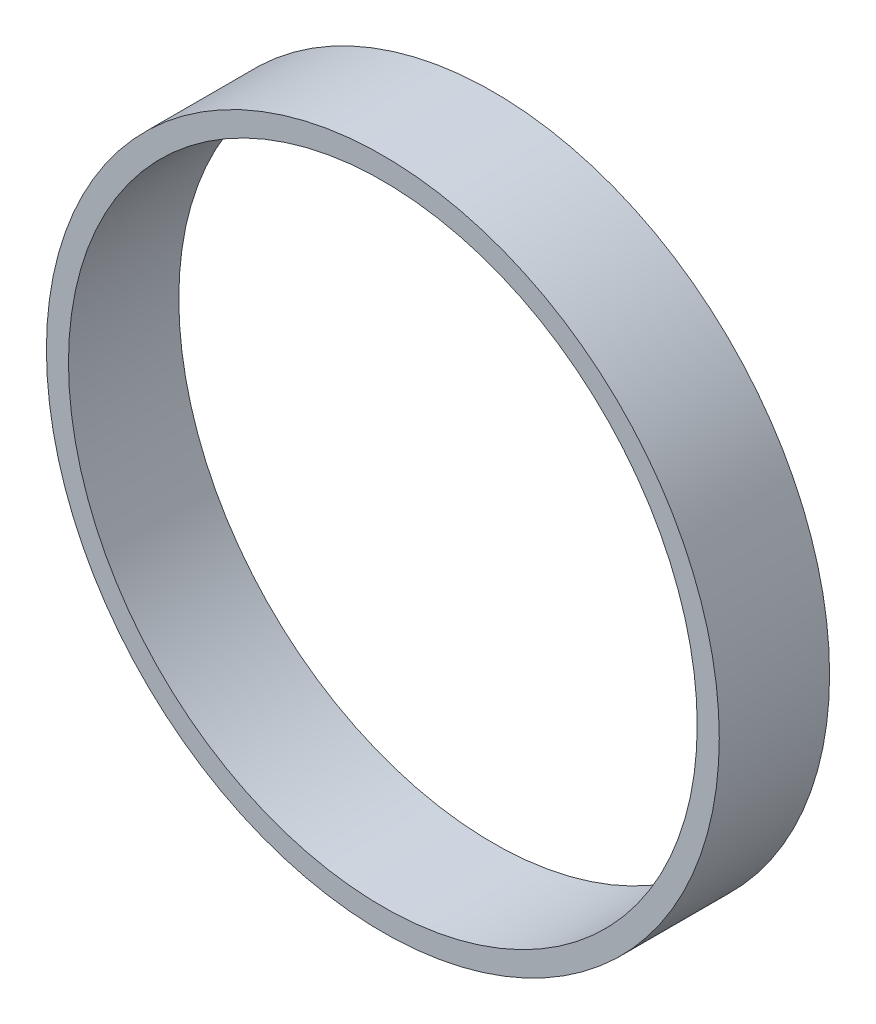
ISO-10303-21;
HEADER;
FILE_DESCRIPTION(('STEP AP214'),'2;1');
FILE_NAME('part.step','',(''),(''),'','','');
FILE_SCHEMA(('AUTOMOTIVE_DESIGN { 1 0 10303 214 1 1 1 1 }'));
ENDSEC;
DATA;
#1=APPLICATION_CONTEXT('core data for automotive mechanical design processes');
#2=APPLICATION_PROTOCOL_DEFINITION('international standard','automotive_design',2000,#1);
#3=PRODUCT_CONTEXT('',#1,'mechanical');
#4=PRODUCT('Part','Part','',(#3));
#5=PRODUCT_RELATED_PRODUCT_CATEGORY('part','',(#4));
#6=PRODUCT_DEFINITION_FORMATION('','',#4);
#7=PRODUCT_DEFINITION_CONTEXT('part definition',#1,'design');
#8=PRODUCT_DEFINITION('design','',#6,#7);
#9=PRODUCT_DEFINITION_SHAPE('','',#8);
#10=(LENGTH_UNIT() NAMED_UNIT(*) SI_UNIT(.MILLI.,.METRE.));
#11=(NAMED_UNIT(*) PLANE_ANGLE_UNIT() SI_UNIT($,.RADIAN.));
#12=(NAMED_UNIT(*) SI_UNIT($,.STERADIAN.) SOLID_ANGLE_UNIT());
#13=UNCERTAINTY_MEASURE_WITH_UNIT(LENGTH_MEASURE(1.E-05),#10,'distance_accuracy_value','');
#14=(GEOMETRIC_REPRESENTATION_CONTEXT(3) GLOBAL_UNCERTAINTY_ASSIGNED_CONTEXT((#13)) GLOBAL_UNIT_ASSIGNED_CONTEXT((#10,
#11,#12)) REPRESENTATION_CONTEXT('',''));
#15=CARTESIAN_POINT('',(0.,0.,0.));
#16=DIRECTION('',(0.,0.,1.));
#17=DIRECTION('',(1.,0.,0.));
#18=AXIS2_PLACEMENT_3D('',#15,#16,#17);
#19=CARTESIAN_POINT('',(0.,0.,10.));
#20=DIRECTION('',(0.,0.,1.));
#21=DIRECTION('',(1.,0.,0.));
#22=AXIS2_PLACEMENT_3D('',#19,#20,#21);
#23=PLANE('',#22);
#24=CARTESIAN_POINT('',(0.,0.,10.));
#25=DIRECTION('',(0.,0.,1.));
#26=DIRECTION('',(1.,0.,0.));
#27=AXIS2_PLACEMENT_3D('',#24,#25,#26);
#28=CIRCLE('',#27,30.5);
#29=CARTESIAN_POINT('',(30.5,0.,10.));
#30=VERTEX_POINT('',#29);
#31=EDGE_CURVE('E10',#30,#30,#28,.T.);
#32=ORIENTED_EDGE('',*,*,#31,.T.);
#33=EDGE_LOOP('',(#32));
#34=FACE_BOUND('',#33,.T.);
#35=CARTESIAN_POINT('',(0.,0.,10.));
#36=DIRECTION('',(0.,0.,1.));
#37=DIRECTION('',(1.,0.,0.));
#38=AXIS2_PLACEMENT_3D('',#35,#36,#37);
#39=CIRCLE('',#38,28.5);
#40=CARTESIAN_POINT('',(28.5,0.,10.));
#41=VERTEX_POINT('',#40);
#42=EDGE_CURVE('E42',#41,#41,#39,.T.);
#43=ORIENTED_EDGE('',*,*,#42,.F.);
#44=EDGE_LOOP('',(#43));
#45=FACE_BOUND('',#44,.T.);
#46=ADVANCED_FACE('F31',(#34,#45),#23,.T.);
#47=CARTESIAN_POINT('',(0.,0.,0.));
#48=DIRECTION('',(0.,0.,1.));
#49=DIRECTION('',(1.,0.,0.));
#50=AXIS2_PLACEMENT_3D('',#47,#48,#49);
#51=PLANE('',#50);
#52=CARTESIAN_POINT('',(0.,0.,0.));
#53=DIRECTION('',(0.,0.,1.));
#54=DIRECTION('',(1.,0.,0.));
#55=AXIS2_PLACEMENT_3D('',#52,#53,#54);
#56=CIRCLE('',#55,30.5);
#57=CARTESIAN_POINT('',(30.5,0.,0.));
#58=VERTEX_POINT('',#57);
#59=EDGE_CURVE('E35',#58,#58,#56,.T.);
#60=ORIENTED_EDGE('',*,*,#59,.F.);
#61=EDGE_LOOP('',(#60));
#62=FACE_BOUND('',#61,.T.);
#63=CARTESIAN_POINT('',(0.,0.,0.));
#64=DIRECTION('',(0.,0.,1.));
#65=DIRECTION('',(1.,0.,0.));
#66=AXIS2_PLACEMENT_3D('',#63,#64,#65);
#67=CIRCLE('',#66,28.5);
#68=CARTESIAN_POINT('',(28.5,0.,0.));
#69=VERTEX_POINT('',#68);
#70=EDGE_CURVE('E44',#69,#69,#67,.T.);
#71=ORIENTED_EDGE('',*,*,#70,.T.);
#72=EDGE_LOOP('',(#71));
#73=FACE_BOUND('',#72,.T.);
#74=ADVANCED_FACE('F54',(#62,#73),#51,.F.);
#75=CARTESIAN_POINT('',(0.,0.,10.));
#76=DIRECTION('',(0.,0.,-1.));
#77=DIRECTION('',(-1.,0.,0.));
#78=AXIS2_PLACEMENT_3D('',#75,#76,#77);
#79=CYLINDRICAL_SURFACE('',#78,30.5);
#80=ORIENTED_EDGE('',*,*,#31,.F.);
#81=EDGE_LOOP('',(#80));
#82=FACE_BOUND('',#81,.T.);
#83=ORIENTED_EDGE('',*,*,#59,.T.);
#84=EDGE_LOOP('',(#83));
#85=FACE_BOUND('',#84,.T.);
#86=ADVANCED_FACE('F33',(#82,#85),#79,.T.);
#87=CARTESIAN_POINT('',(0.,0.,10.));
#88=DIRECTION('',(0.,0.,-1.));
#89=DIRECTION('',(-1.,0.,0.));
#90=AXIS2_PLACEMENT_3D('',#87,#88,#89);
#91=CYLINDRICAL_SURFACE('',#90,28.5);
#92=ORIENTED_EDGE('',*,*,#42,.T.);
#93=EDGE_LOOP('',(#92));
#94=FACE_BOUND('',#93,.T.);
#95=ORIENTED_EDGE('',*,*,#70,.F.);
#96=EDGE_LOOP('',(#95));
#97=FACE_BOUND('',#96,.T.);
#98=ADVANCED_FACE('F50',(#94,#97),#91,.F.);
#99=CLOSED_SHELL('',(#46,#74,#86,#98));
#100=MANIFOLD_SOLID_BREP('B2',#99);
#101=ADVANCED_BREP_SHAPE_REPRESENTATION('',(#18,#100),#14);
#102=SHAPE_DEFINITION_REPRESENTATION(#9,#101);
ENDSEC;
END-ISO-10303-21;
